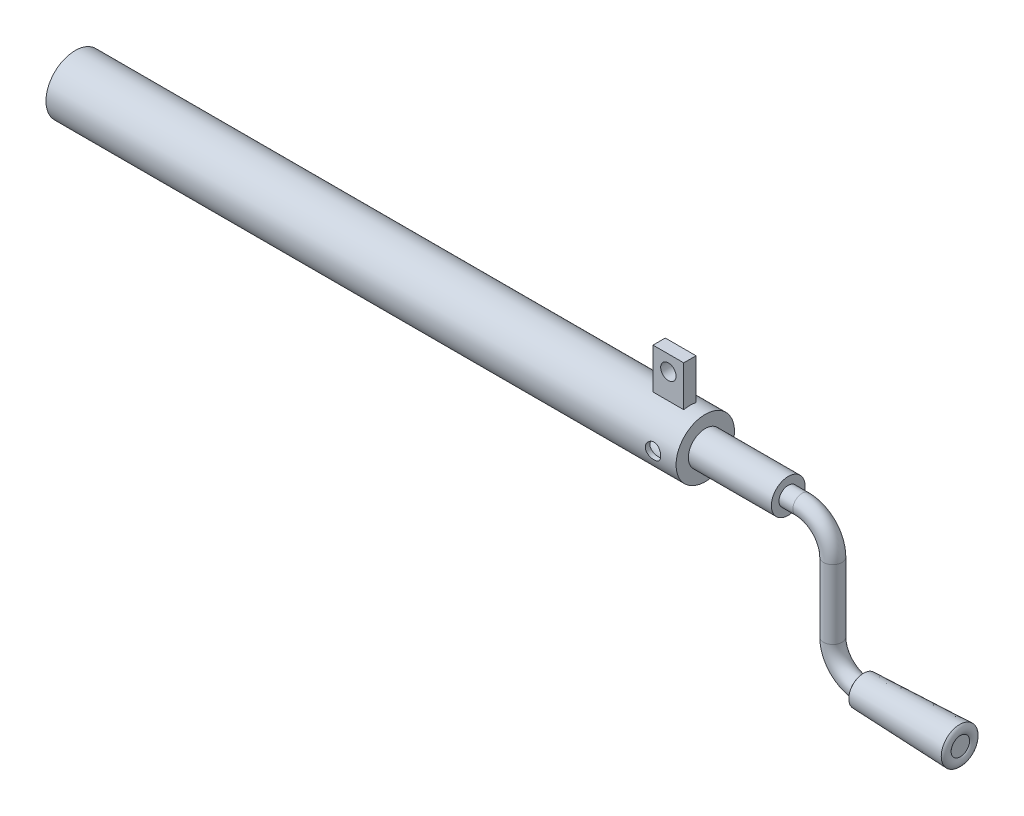
ISO-10303-21;
HEADER;
FILE_DESCRIPTION(('STEP AP214'),'2;1');
FILE_NAME('part.step','',(''),(''),'','','');
FILE_SCHEMA(('AUTOMOTIVE_DESIGN { 1 0 10303 214 1 1 1 1 }'));
ENDSEC;
DATA;
#1=APPLICATION_CONTEXT('core data for automotive mechanical design processes');
#2=APPLICATION_PROTOCOL_DEFINITION('international standard','automotive_design',2000,#1);
#3=PRODUCT_CONTEXT('',#1,'mechanical');
#4=PRODUCT('Part','Part','',(#3));
#5=PRODUCT_RELATED_PRODUCT_CATEGORY('part','',(#4));
#6=PRODUCT_DEFINITION_FORMATION('','',#4);
#7=PRODUCT_DEFINITION_CONTEXT('part definition',#1,'design');
#8=PRODUCT_DEFINITION('design','',#6,#7);
#9=PRODUCT_DEFINITION_SHAPE('','',#8);
#10=(LENGTH_UNIT() NAMED_UNIT(*) SI_UNIT(.MILLI.,.METRE.));
#11=(NAMED_UNIT(*) PLANE_ANGLE_UNIT() SI_UNIT($,.RADIAN.));
#12=(NAMED_UNIT(*) SI_UNIT($,.STERADIAN.) SOLID_ANGLE_UNIT());
#13=UNCERTAINTY_MEASURE_WITH_UNIT(LENGTH_MEASURE(1.E-05),#10,'distance_accuracy_value','');
#14=(GEOMETRIC_REPRESENTATION_CONTEXT(3) GLOBAL_UNCERTAINTY_ASSIGNED_CONTEXT((#13)) GLOBAL_UNIT_ASSIGNED_CONTEXT((#10,
#11,#12)) REPRESENTATION_CONTEXT('',''));
#15=CARTESIAN_POINT('',(0.,0.,0.));
#16=DIRECTION('',(0.,0.,1.));
#17=DIRECTION('',(1.,0.,0.));
#18=AXIS2_PLACEMENT_3D('',#15,#16,#17);
#19=CARTESIAN_POINT('',(464.,0.,0.));
#20=DIRECTION('',(1.,0.,0.));
#21=DIRECTION('',(0.,0.,-1.));
#22=AXIS2_PLACEMENT_3D('',#19,#20,#21);
#23=PLANE('',#22);
#24=CARTESIAN_POINT('',(464.,0.,0.));
#25=DIRECTION('',(1.,0.,0.));
#26=DIRECTION('',(0.,0.,-1.));
#27=AXIS2_PLACEMENT_3D('',#24,#25,#26);
#28=CIRCLE('',#27,11.);
#29=CARTESIAN_POINT('',(464.,0.,-11.));
#30=VERTEX_POINT('',#29);
#31=EDGE_CURVE('E12',#30,#30,#28,.T.);
#32=ORIENTED_EDGE('',*,*,#31,.T.);
#33=EDGE_LOOP('',(#32));
#34=FACE_BOUND('',#33,.T.);
#35=CARTESIAN_POINT('',(464.,0.,0.));
#36=DIRECTION('',(1.,0.,0.));
#37=DIRECTION('',(0.,0.,-1.));
#38=AXIS2_PLACEMENT_3D('',#35,#36,#37);
#39=CIRCLE('',#38,6.);
#40=CARTESIAN_POINT('',(464.,0.,-6.));
#41=VERTEX_POINT('',#40);
#42=EDGE_CURVE('E78',#41,#41,#39,.T.);
#43=ORIENTED_EDGE('',*,*,#42,.F.);
#44=EDGE_LOOP('',(#43));
#45=FACE_BOUND('',#44,.T.);
#46=ADVANCED_FACE('F67',(#34,#45),#23,.T.);
#47=CARTESIAN_POINT('',(410.,0.,0.));
#48=DIRECTION('',(1.,0.,0.));
#49=DIRECTION('',(0.,0.,-1.));
#50=AXIS2_PLACEMENT_3D('',#47,#48,#49);
#51=PLANE('',#50);
#52=CARTESIAN_POINT('',(410.,0.,0.));
#53=DIRECTION('',(1.,0.,0.));
#54=DIRECTION('',(0.,0.,-1.));
#55=AXIS2_PLACEMENT_3D('',#52,#53,#54);
#56=CIRCLE('',#55,11.);
#57=CARTESIAN_POINT('',(410.,0.,-11.));
#58=VERTEX_POINT('',#57);
#59=EDGE_CURVE('E71',#58,#58,#56,.T.);
#60=ORIENTED_EDGE('',*,*,#59,.F.);
#61=EDGE_LOOP('',(#60));
#62=FACE_BOUND('',#61,.T.);
#63=CARTESIAN_POINT('',(410.,0.,0.));
#64=DIRECTION('',(1.,0.,0.));
#65=DIRECTION('',(0.,0.,-1.));
#66=AXIS2_PLACEMENT_3D('',#63,#64,#65);
#67=CIRCLE('',#66,6.);
#68=CARTESIAN_POINT('',(410.,0.,-6.));
#69=VERTEX_POINT('',#68);
#70=EDGE_CURVE('E80',#69,#69,#67,.T.);
#71=ORIENTED_EDGE('',*,*,#70,.T.);
#72=EDGE_LOOP('',(#71));
#73=FACE_BOUND('',#72,.T.);
#74=ADVANCED_FACE('F90',(#62,#73),#51,.F.);
#75=CARTESIAN_POINT('',(464.,0.,0.));
#76=DIRECTION('',(-1.,0.,0.));
#77=DIRECTION('',(0.,0.,1.));
#78=AXIS2_PLACEMENT_3D('',#75,#76,#77);
#79=CYLINDRICAL_SURFACE('',#78,11.);
#80=ORIENTED_EDGE('',*,*,#31,.F.);
#81=EDGE_LOOP('',(#80));
#82=FACE_BOUND('',#81,.T.);
#83=ORIENTED_EDGE('',*,*,#59,.T.);
#84=EDGE_LOOP('',(#83));
#85=FACE_BOUND('',#84,.T.);
#86=ADVANCED_FACE('F69',(#82,#85),#79,.T.);
#87=CARTESIAN_POINT('',(464.,0.,0.));
#88=DIRECTION('',(-1.,0.,0.));
#89=DIRECTION('',(0.,0.,1.));
#90=AXIS2_PLACEMENT_3D('',#87,#88,#89);
#91=CYLINDRICAL_SURFACE('',#90,6.);
#92=ORIENTED_EDGE('',*,*,#42,.T.);
#93=EDGE_LOOP('',(#92));
#94=FACE_BOUND('',#93,.T.);
#95=ORIENTED_EDGE('',*,*,#70,.F.);
#96=EDGE_LOOP('',(#95));
#97=FACE_BOUND('',#96,.T.);
#98=ADVANCED_FACE('F86',(#94,#97),#91,.F.);
#99=CLOSED_SHELL('',(#46,#74,#86,#98));
#100=MANIFOLD_SOLID_BREP('B2',#99);
#101=CARTESIAN_POINT('',(410.,0.,0.));
#102=DIRECTION('',(-1.,0.,0.));
#103=DIRECTION('',(0.,0.,1.));
#104=AXIS2_PLACEMENT_3D('',#101,#102,#103);
#105=CYLINDRICAL_SURFACE('',#104,16.);
#106=CARTESIAN_POINT('',(0.,0.,0.));
#107=DIRECTION('',(1.,0.,0.));
#108=DIRECTION('',(0.,0.,-1.));
#109=AXIS2_PLACEMENT_3D('',#106,#107,#108);
#110=CIRCLE('',#109,16.);
#111=CARTESIAN_POINT('',(0.,0.,-16.));
#112=VERTEX_POINT('',#111);
#113=EDGE_CURVE('E233',#112,#112,#110,.T.);
#114=ORIENTED_EDGE('',*,*,#113,.F.);
#115=EDGE_LOOP('',(#114));
#116=FACE_BOUND('',#115,.T.);
#117=CARTESIAN_POINT('',(400.,0.,-16.));
#118=CARTESIAN_POINT('',(399.99999821365,0.273756740698176,-15.9999986351195));
#119=CARTESIAN_POINT('',(399.977443092222,0.547532210011403,-15.9929077993933));
#120=CARTESIAN_POINT('',(399.888055033843,1.08707683835381,-15.9653157635526));
#121=CARTESIAN_POINT('',(399.821212074542,1.35284417090373,-15.9448115279957));
#122=CARTESIAN_POINT('',(399.645722515217,1.86851417460313,-15.892632627915));
#123=CARTESIAN_POINT('',(399.537140621389,2.11844070794285,-15.860975259956));
#124=CARTESIAN_POINT('',(399.281530729286,2.59653920938622,-15.7897587664487));
#125=CARTESIAN_POINT('',(399.134496672876,2.82470774178094,-15.7501983960149));
#126=CARTESIAN_POINT('',(398.801376031933,3.2598613398077,-15.6660085495921));
#127=CARTESIAN_POINT('',(398.614316459763,3.46608011262122,-15.621268637007));
#128=CARTESIAN_POINT('',(398.208526430338,3.84478952815345,-15.5324018550409));
#129=CARTESIAN_POINT('',(397.989790089993,4.01727389161515,-15.4882751012093));
#130=CARTESIAN_POINT('',(397.520221744793,4.32777345930636,-15.4044457876485));
#131=CARTESIAN_POINT('',(397.268730089992,4.4648313659311,-15.3648795310221));
#132=CARTESIAN_POINT('',(396.744830740177,4.69438964299239,-15.2963120709366));
#133=CARTESIAN_POINT('',(396.472428576856,4.78690175085854,-15.2673080849026));
#134=CARTESIAN_POINT('',(395.923087690166,4.92193839721856,-15.224304279618));
#135=CARTESIAN_POINT('',(395.646532625432,4.96588440031618,-15.2098789171452));
#136=CARTESIAN_POINT('',(395.089627524365,5.00698220147792,-15.1964022056731));
#137=CARTESIAN_POINT('',(394.809278516739,5.00414643984172,-15.1973467694717));
#138=CARTESIAN_POINT('',(394.264502158889,4.95287298929816,-15.2141275626545));
#139=CARTESIAN_POINT('',(393.999883496448,4.90624231472932,-15.229373668447));
#140=CARTESIAN_POINT('',(393.482431373751,4.77163253417958,-15.272081024701));
#141=CARTESIAN_POINT('',(393.229599169142,4.68364903377185,-15.2995435733467));
#142=CARTESIAN_POINT('',(392.738592222302,4.46755498726519,-15.3640417609541));
#143=CARTESIAN_POINT('',(392.500685557241,4.33887702648703,-15.4012113865356));
#144=CARTESIAN_POINT('',(392.049248928475,4.0454408295101,-15.4808742631002));
#145=CARTESIAN_POINT('',(391.835725318983,3.88067322086203,-15.523368895754));
#146=CARTESIAN_POINT('',(391.428900226334,3.51086781672957,-15.6112611120491));
#147=CARTESIAN_POINT('',(391.236961768882,3.30433828237154,-15.6567027842357));
#148=CARTESIAN_POINT('',(390.890112425681,2.86145763238182,-15.7436628303753));
#149=CARTESIAN_POINT('',(390.735204283123,2.625104309396,-15.7851809135328));
#150=CARTESIAN_POINT('',(390.465889245595,2.1266584418619,-15.8600517956098));
#151=CARTESIAN_POINT('',(390.351807458144,1.86437962767713,-15.8933384259289));
#152=CARTESIAN_POINT('',(390.169787996594,1.32307191113054,-15.9475182331416));
#153=CARTESIAN_POINT('',(390.101836311046,1.04404812289841,-15.9684151730059));
#154=CARTESIAN_POINT('',(390.016327829684,0.488740629161367,-15.9948555758007));
#155=CARTESIAN_POINT('',(389.996925825626,0.212767395155359,-16.0009609158175));
#156=CARTESIAN_POINT('',(390.003864906549,-0.338521222930353,-15.9987919892393));
#157=CARTESIAN_POINT('',(390.03019930929,-0.613836697226041,-15.9905198232454));
#158=CARTESIAN_POINT('',(390.126382370426,-1.1488773319034,-15.9608945507905));
#159=CARTESIAN_POINT('',(390.19513307045,-1.40881991368376,-15.9398717244275));
#160=CARTESIAN_POINT('',(390.372857409467,-1.91340771544551,-15.8872048551716));
#161=CARTESIAN_POINT('',(390.4818360161,-2.15805104179623,-15.8555595005737));
#162=CARTESIAN_POINT('',(390.739892866195,-2.63172962668875,-15.783941710377));
#163=CARTESIAN_POINT('',(390.889883949987,-2.86023895915117,-15.7437850727067));
#164=CARTESIAN_POINT('',(391.22461284047,-3.28946340384104,-15.6597364001372));
#165=CARTESIAN_POINT('',(391.409360070979,-3.49017095217579,-15.6158433539155));
#166=CARTESIAN_POINT('',(391.817035560208,-3.86634985167606,-15.5270797953257));
#167=CARTESIAN_POINT('',(392.041186654957,-4.04050609358124,-15.4822394682577));
#168=CARTESIAN_POINT('',(392.516506465507,-4.34885000980605,-15.3984778838242));
#169=CARTESIAN_POINT('',(392.767674752108,-4.48303831893718,-15.3595565324524));
#170=CARTESIAN_POINT('',(393.289380691482,-4.70680333922168,-15.2924712932348));
#171=CARTESIAN_POINT('',(393.559838597743,-4.79655278224049,-15.264265854275));
#172=CARTESIAN_POINT('',(394.113089972994,-4.9289157727236,-15.2220468337724));
#173=CARTESIAN_POINT('',(394.395878705374,-4.97154725655978,-15.2080278520491));
#174=CARTESIAN_POINT('',(394.952016350322,-5.00717624632502,-15.1963317085551));
#175=CARTESIAN_POINT('',(395.22521381539,-5.00233118486541,-15.1979441840057));
#176=CARTESIAN_POINT('',(395.766698339768,-4.94835272515332,-15.2156036150361));
#177=CARTESIAN_POINT('',(396.034985627547,-4.89922139290047,-15.2316498972642));
#178=CARTESIAN_POINT('',(396.555176158367,-4.7595091965447,-15.2758725673356));
#179=CARTESIAN_POINT('',(396.807261764373,-4.66954569624033,-15.3038679276103));
#180=CARTESIAN_POINT('',(397.292961654136,-4.45120909339998,-15.3687881701826));
#181=CARTESIAN_POINT('',(397.526572168314,-4.32282817776947,-15.4057148685869));
#182=CARTESIAN_POINT('',(397.978583881759,-4.02542700053973,-15.4861394813401));
#183=CARTESIAN_POINT('',(398.196032518001,-3.85501334096528,-15.5298379569183));
#184=CARTESIAN_POINT('',(398.599945312448,-3.48083598561918,-15.6179599528484));
#185=CARTESIAN_POINT('',(398.786401155964,-3.27706336937753,-15.6623836642662));
#186=CARTESIAN_POINT('',(399.129130153452,-2.83394665129336,-15.7486908780989));
#187=CARTESIAN_POINT('',(399.2842189458,-2.59365829794952,-15.7904440692269));
#188=CARTESIAN_POINT('',(399.551595660558,-2.08911655205459,-15.8650707718751));
#189=CARTESIAN_POINT('',(399.663900408567,-1.82487263118178,-15.8979477726329));
#190=CARTESIAN_POINT('',(399.834365470434,-1.3029905414959,-15.9488260293388));
#191=CARTESIAN_POINT('',(399.896299469221,-1.04668134845018,-15.9678496322456));
#192=CARTESIAN_POINT('',(399.979113439871,-0.526919581760985,-15.9934360136194));
#193=CARTESIAN_POINT('',(400.000001719216,-0.26346846455869,-16.0000013135858));
#194=CARTESIAN_POINT('',(400.,0.,-16.));
#195=B_SPLINE_CURVE_WITH_KNOTS('',3,(#117,#118,#119,#120,#121,#122,#123,#124,#125,#126,#127,
#128,#129,#130,#131,#132,#133,#134,#135,#136,#137,#138,#139,#140,#141,#142,#143,#144,#145,#146,
#147,#148,#149,#150,#151,#152,#153,#154,#155,#156,#157,#158,#159,#160,#161,#162,#163,#164,#165,
#166,#167,#168,#169,#170,#171,#172,#173,#174,#175,#176,#177,#178,#179,#180,#181,#182,#183,#184,
#185,#186,#187,#188,#189,#190,#191,#192,#193,#194),.UNSPECIFIED.,.T.,.F.,(4,2,2,2,2,2,2,2,2,2,2,
2,2,2,2,2,2,2,2,2,2,2,2,2,2,2,2,2,2,2,2,2,2,2,2,2,2,2,4),(0.,0.820301797730033,1.64078929339626,
2.46000991680977,3.27935968623355,4.12151288780638,4.96382269725106,5.82695084991454,
6.68985145121467,7.52676600672195,8.36345801183908,9.167076696952,9.97078079925605,
10.7862257089153,11.6018826405078,12.4546698912775,13.3075202966256,14.1670184276843,
15.0262553798757,15.852302742023,16.678229426068,17.4836250690084,18.2891202014735,
19.1142529896272,19.9396098284638,20.797671148619,21.6557188394419,22.5104046302277,
23.3647649559871,24.1804881394268,24.9961732705187,25.7999165363422,26.6038233736823,
27.4391805607299,28.274761495409,29.1376267255319,30.0001522671288,30.789785466537,
31.5792588309973),.UNSPECIFIED.);
#196=CARTESIAN_POINT('',(400.,0.,-16.));
#197=VERTEX_POINT('',#196);
#198=EDGE_CURVE('E193',#197,#197,#195,.T.);
#199=ORIENTED_EDGE('',*,*,#198,.F.);
#200=CARTESIAN_POINT('',(400.,-1.2490009027033E-13,0.));
#201=DIRECTION('',(1.,0.,0.));
#202=DIRECTION('',(0.,0.,-1.));
#203=AXIS2_PLACEMENT_3D('',#200,#201,#202);
#204=CIRCLE('',#203,16.0000000000001);
#205=CARTESIAN_POINT('',(400.,0.,16.0000000000001));
#206=VERTEX_POINT('',#205);
#207=EDGE_CURVE('E154',#197,#206,#204,.T.);
#208=ORIENTED_EDGE('',*,*,#207,.T.);
#209=CARTESIAN_POINT('',(400.,0.,16.));
#210=CARTESIAN_POINT('',(399.99999821365,-0.273756740698179,15.9999986351195));
#211=CARTESIAN_POINT('',(399.977443092222,-0.547532210011409,15.9929077993933));
#212=CARTESIAN_POINT('',(399.888055033843,-1.08707683835382,15.9653157635526));
#213=CARTESIAN_POINT('',(399.821212074542,-1.35284417090373,15.9448115279957));
#214=CARTESIAN_POINT('',(399.645722515217,-1.86851417460312,15.892632627915));
#215=CARTESIAN_POINT('',(399.537140621389,-2.11844070794283,15.860975259956));
#216=CARTESIAN_POINT('',(399.281530729286,-2.5965392093862,15.7897587664487));
#217=CARTESIAN_POINT('',(399.134496672876,-2.82470774178093,15.7501983960149));
#218=CARTESIAN_POINT('',(398.801376031933,-3.2598613398077,15.6660085495921));
#219=CARTESIAN_POINT('',(398.614316459763,-3.46608011262122,15.621268637007));
#220=CARTESIAN_POINT('',(398.208526430338,-3.84478952815345,15.5324018550409));
#221=CARTESIAN_POINT('',(397.989790089993,-4.01727389161515,15.4882751012093));
#222=CARTESIAN_POINT('',(397.520221744793,-4.32777345930636,15.4044457876485));
#223=CARTESIAN_POINT('',(397.268730089992,-4.4648313659311,15.3648795310221));
#224=CARTESIAN_POINT('',(396.744830740177,-4.69438964299239,15.2963120709366));
#225=CARTESIAN_POINT('',(396.472428576856,-4.78690175085854,15.2673080849026));
#226=CARTESIAN_POINT('',(395.923087690166,-4.92193839721856,15.224304279618));
#227=CARTESIAN_POINT('',(395.646532625432,-4.96588440031618,15.2098789171452));
#228=CARTESIAN_POINT('',(395.089627524365,-5.00698220147792,15.1964022056731));
#229=CARTESIAN_POINT('',(394.809278516739,-5.00414643984172,15.1973467694717));
#230=CARTESIAN_POINT('',(394.264502158889,-4.95287298929816,15.2141275626545));
#231=CARTESIAN_POINT('',(393.999883496448,-4.90624231472932,15.229373668447));
#232=CARTESIAN_POINT('',(393.482431373751,-4.77163253417958,15.272081024701));
#233=CARTESIAN_POINT('',(393.229599169142,-4.68364903377185,15.2995435733467));
#234=CARTESIAN_POINT('',(392.738592222302,-4.46755498726519,15.3640417609541));
#235=CARTESIAN_POINT('',(392.500685557241,-4.33887702648703,15.4012113865356));
#236=CARTESIAN_POINT('',(392.049248928475,-4.0454408295101,15.4808742631002));
#237=CARTESIAN_POINT('',(391.835725318983,-3.88067322086203,15.523368895754));
#238=CARTESIAN_POINT('',(391.428900226334,-3.51086781672957,15.6112611120491));
#239=CARTESIAN_POINT('',(391.236961768882,-3.30433828237154,15.6567027842357));
#240=CARTESIAN_POINT('',(390.890112425681,-2.86145763238182,15.7436628303753));
#241=CARTESIAN_POINT('',(390.735204283123,-2.625104309396,15.7851809135328));
#242=CARTESIAN_POINT('',(390.465889245595,-2.1266584418619,15.8600517956098));
#243=CARTESIAN_POINT('',(390.351807458144,-1.86437962767713,15.8933384259289));
#244=CARTESIAN_POINT('',(390.169787996594,-1.32307191113054,15.9475182331416));
#245=CARTESIAN_POINT('',(390.101836311046,-1.04404812289841,15.9684151730059));
#246=CARTESIAN_POINT('',(390.016327829684,-0.488740629161367,15.9948555758007));
#247=CARTESIAN_POINT('',(389.996925825626,-0.212767395155359,16.0009609158175));
#248=CARTESIAN_POINT('',(390.003864906549,0.338521222930353,15.9987919892393));
#249=CARTESIAN_POINT('',(390.03019930929,0.613836697226042,15.9905198232454));
#250=CARTESIAN_POINT('',(390.126382370426,1.1488773319034,15.9608945507905));
#251=CARTESIAN_POINT('',(390.19513307045,1.40881991368376,15.9398717244275));
#252=CARTESIAN_POINT('',(390.372857409467,1.91340771544551,15.8872048551716));
#253=CARTESIAN_POINT('',(390.4818360161,2.15805104179623,15.8555595005737));
#254=CARTESIAN_POINT('',(390.739892866195,2.63172962668875,15.783941710377));
#255=CARTESIAN_POINT('',(390.889883949987,2.86023895915117,15.7437850727067));
#256=CARTESIAN_POINT('',(391.22461284047,3.28946340384104,15.6597364001372));
#257=CARTESIAN_POINT('',(391.409360070979,3.49017095217579,15.6158433539155));
#258=CARTESIAN_POINT('',(391.817035560208,3.86634985167606,15.5270797953257));
#259=CARTESIAN_POINT('',(392.041186654957,4.04050609358124,15.4822394682577));
#260=CARTESIAN_POINT('',(392.516506465507,4.34885000980605,15.3984778838242));
#261=CARTESIAN_POINT('',(392.767674752108,4.48303831893718,15.3595565324524));
#262=CARTESIAN_POINT('',(393.289380691482,4.70680333922168,15.2924712932348));
#263=CARTESIAN_POINT('',(393.559838597743,4.79655278224049,15.264265854275));
#264=CARTESIAN_POINT('',(394.113089972994,4.9289157727236,15.2220468337724));
#265=CARTESIAN_POINT('',(394.395878705374,4.97154725655978,15.2080278520491));
#266=CARTESIAN_POINT('',(394.952016350322,5.00717624632502,15.1963317085551));
#267=CARTESIAN_POINT('',(395.22521381539,5.00233118486541,15.1979441840057));
#268=CARTESIAN_POINT('',(395.766698339768,4.94835272515332,15.2156036150361));
#269=CARTESIAN_POINT('',(396.034985627547,4.89922139290047,15.2316498972642));
#270=CARTESIAN_POINT('',(396.555176158367,4.7595091965447,15.2758725673356));
#271=CARTESIAN_POINT('',(396.807261764373,4.66954569624033,15.3038679276103));
#272=CARTESIAN_POINT('',(397.292961654136,4.45120909339998,15.3687881701826));
#273=CARTESIAN_POINT('',(397.526572168314,4.32282817776947,15.4057148685869));
#274=CARTESIAN_POINT('',(397.978583881759,4.02542700053973,15.4861394813401));
#275=CARTESIAN_POINT('',(398.196032518001,3.85501334096528,15.5298379569183));
#276=CARTESIAN_POINT('',(398.599945312448,3.48083598561918,15.6179599528484));
#277=CARTESIAN_POINT('',(398.786401155964,3.27706336937753,15.6623836642662));
#278=CARTESIAN_POINT('',(399.129130153452,2.83394665129336,15.7486908780989));
#279=CARTESIAN_POINT('',(399.2842189458,2.59365829794952,15.7904440692269));
#280=CARTESIAN_POINT('',(399.551595660558,2.08911655205459,15.8650707718751));
#281=CARTESIAN_POINT('',(399.663900408567,1.82487263118178,15.8979477726329));
#282=CARTESIAN_POINT('',(399.834365470434,1.3029905414959,15.9488260293388));
#283=CARTESIAN_POINT('',(399.896299469221,1.04668134845018,15.9678496322456));
#284=CARTESIAN_POINT('',(399.979113439871,0.526919581760985,15.9934360136194));
#285=CARTESIAN_POINT('',(400.000001719216,0.26346846455869,16.0000013135858));
#286=CARTESIAN_POINT('',(400.,0.,16.));
#287=B_SPLINE_CURVE_WITH_KNOTS('',3,(#209,#210,#211,#212,#213,#214,#215,#216,#217,#218,#219,
#220,#221,#222,#223,#224,#225,#226,#227,#228,#229,#230,#231,#232,#233,#234,#235,#236,#237,#238,
#239,#240,#241,#242,#243,#244,#245,#246,#247,#248,#249,#250,#251,#252,#253,#254,#255,#256,#257,
#258,#259,#260,#261,#262,#263,#264,#265,#266,#267,#268,#269,#270,#271,#272,#273,#274,#275,#276,
#277,#278,#279,#280,#281,#282,#283,#284,#285,#286),.UNSPECIFIED.,.T.,.F.,(4,2,2,2,2,2,2,2,2,2,2,
2,2,2,2,2,2,2,2,2,2,2,2,2,2,2,2,2,2,2,2,2,2,2,2,2,2,2,4),(0.,0.820301797730043,1.64078929339626,
2.46000991680975,3.27935968623355,4.12151288780638,4.96382269725106,5.82695084991454,
6.68985145121467,7.52676600672195,8.36345801183908,9.16707669695199,9.97078079925604,
10.7862257089153,11.6018826405078,12.4546698912775,13.3075202966256,14.1670184276843,
15.0262553798757,15.852302742023,16.678229426068,17.4836250690084,18.2891202014735,
19.1142529896272,19.9396098284638,20.797671148619,21.6557188394419,22.5104046302277,
23.3647649559871,24.1804881394268,24.9961732705187,25.7999165363422,26.6038233736823,
27.4391805607298,28.274761495409,29.1376267255318,30.0001522671288,30.789785466537,
31.5792588309973),.UNSPECIFIED.);
#288=EDGE_CURVE('E138',#206,#206,#287,.T.);
#289=ORIENTED_EDGE('',*,*,#288,.F.);
#290=EDGE_CURVE('E184',#206,#197,#204,.T.);
#291=ORIENTED_EDGE('',*,*,#290,.T.);
#292=EDGE_LOOP('',(#199,#208,#289,#291));
#293=FACE_BOUND('',#292,.T.);
#294=ADVANCED_FACE('F133',(#116,#293),#105,.F.);
#295=CARTESIAN_POINT('',(410.,0.,0.));
#296=DIRECTION('',(1.,0.,0.));
#297=DIRECTION('',(0.,0.,-1.));
#298=AXIS2_PLACEMENT_3D('',#295,#296,#297);
#299=PLANE('',#298);
#300=CARTESIAN_POINT('',(410.,-1.2490009027033E-13,0.));
#301=DIRECTION('',(-1.,0.,0.));
#302=DIRECTION('',(0.,0.,1.));
#303=AXIS2_PLACEMENT_3D('',#300,#301,#302);
#304=CIRCLE('',#303,6.);
#305=CARTESIAN_POINT('',(410.,-1.2490009027033E-13,6.));
#306=VERTEX_POINT('',#305);
#307=EDGE_CURVE('E518',#306,#306,#304,.T.);
#308=ORIENTED_EDGE('',*,*,#307,.T.);
#309=EDGE_LOOP('',(#308));
#310=FACE_BOUND('',#309,.T.);
#311=CARTESIAN_POINT('',(410.,0.,0.));
#312=DIRECTION('',(1.,0.,0.));
#313=DIRECTION('',(0.,0.,-1.));
#314=AXIS2_PLACEMENT_3D('',#311,#312,#313);
#315=CIRCLE('',#314,19.);
#316=CARTESIAN_POINT('',(410.,0.,-19.));
#317=VERTEX_POINT('',#316);
#318=EDGE_CURVE('E65',#317,#317,#315,.T.);
#319=ORIENTED_EDGE('',*,*,#318,.T.);
#320=EDGE_LOOP('',(#319));
#321=FACE_BOUND('',#320,.T.);
#322=ADVANCED_FACE('F243',(#310,#321),#299,.T.);
#323=CARTESIAN_POINT('',(0.,0.,0.));
#324=DIRECTION('',(1.,0.,0.));
#325=DIRECTION('',(0.,0.,-1.));
#326=AXIS2_PLACEMENT_3D('',#323,#324,#325);
#327=PLANE('',#326);
#328=CARTESIAN_POINT('',(0.,0.,0.));
#329=DIRECTION('',(1.,0.,0.));
#330=DIRECTION('',(0.,0.,-1.));
#331=AXIS2_PLACEMENT_3D('',#328,#329,#330);
#332=CIRCLE('',#331,19.);
#333=CARTESIAN_POINT('',(0.,0.,-19.));
#334=VERTEX_POINT('',#333);
#335=EDGE_CURVE('E147',#334,#334,#332,.T.);
#336=ORIENTED_EDGE('',*,*,#335,.F.);
#337=EDGE_LOOP('',(#336));
#338=FACE_BOUND('',#337,.T.);
#339=ORIENTED_EDGE('',*,*,#113,.T.);
#340=EDGE_LOOP('',(#339));
#341=FACE_BOUND('',#340,.T.);
#342=ADVANCED_FACE('F241',(#338,#341),#327,.F.);
#343=CARTESIAN_POINT('',(410.,0.,0.));
#344=DIRECTION('',(-1.,0.,0.));
#345=DIRECTION('',(0.,0.,1.));
#346=AXIS2_PLACEMENT_3D('',#343,#344,#345);
#347=CYLINDRICAL_SURFACE('',#346,19.);
#348=DIRECTION('',(-1.,0.,0.));
#349=VECTOR('',#348,1.);
#350=CARTESIAN_POINT('',(410.,18.5741756210067,-4.00000000000001));
#351=LINE('',#350,#349);
#352=CARTESIAN_POINT('',(400.,18.5741756209836,-4.));
#353=VERTEX_POINT('',#352);
#354=CARTESIAN_POINT('',(380.,18.5741756210067,-3.99999999999999));
#355=VERTEX_POINT('',#354);
#356=EDGE_CURVE('E474',#353,#355,#351,.T.);
#357=ORIENTED_EDGE('',*,*,#356,.F.);
#358=CARTESIAN_POINT('',(400.,0.,0.));
#359=DIRECTION('',(1.,0.,0.));
#360=DIRECTION('',(0.,0.,-1.));
#361=AXIS2_PLACEMENT_3D('',#358,#359,#360);
#362=CIRCLE('',#361,19.);
#363=CARTESIAN_POINT('',(400.,18.5741756209836,4.));
#364=VERTEX_POINT('',#363);
#365=EDGE_CURVE('E227',#364,#353,#362,.F.);
#366=ORIENTED_EDGE('',*,*,#365,.F.);
#367=DIRECTION('',(-1.,0.,0.));
#368=VECTOR('',#367,1.);
#369=CARTESIAN_POINT('',(410.,18.5741756210067,4.));
#370=LINE('',#369,#368);
#371=CARTESIAN_POINT('',(380.,18.5741756209836,4.));
#372=VERTEX_POINT('',#371);
#373=EDGE_CURVE('E477',#372,#364,#370,.F.);
#374=ORIENTED_EDGE('',*,*,#373,.F.);
#375=CARTESIAN_POINT('',(380.,0.,0.));
#376=DIRECTION('',(-1.,0.,0.));
#377=DIRECTION('',(0.,0.,1.));
#378=AXIS2_PLACEMENT_3D('',#375,#376,#377);
#379=CIRCLE('',#378,19.);
#380=EDGE_CURVE('E476',#355,#372,#379,.F.);
#381=ORIENTED_EDGE('',*,*,#380,.F.);
#382=EDGE_LOOP('',(#357,#366,#374,#381));
#383=FACE_BOUND('',#382,.T.);
#384=CARTESIAN_POINT('',(400.,0.,19.));
#385=CARTESIAN_POINT('',(399.999993183317,-0.27576932640033,18.9999957178638));
#386=CARTESIAN_POINT('',(399.977108837027,-0.551612339964101,18.9939369110743));
#387=CARTESIAN_POINT('',(399.886332722549,-1.09536084420814,18.9703552522905));
#388=CARTESIAN_POINT('',(399.81841846832,-1.36326229934773,18.9528266728315));
#389=CARTESIAN_POINT('',(399.639936849204,-1.88319959043664,18.9082415265209));
#390=CARTESIAN_POINT('',(399.529423671219,-2.13525511097028,18.8811970679014));
#391=CARTESIAN_POINT('',(399.269079957872,-2.61725305763117,18.8204430306565));
#392=CARTESIAN_POINT('',(399.119247076392,-2.84719416312158,18.7867330543442));
#393=CARTESIAN_POINT('',(398.780936768605,-3.28363987258851,18.7154388327318));
#394=CARTESIAN_POINT('',(398.591735344869,-3.48957269264307,18.6777897345587));
#395=CARTESIAN_POINT('',(398.181606882668,-3.86718169173116,18.6032800591516));
#396=CARTESIAN_POINT('',(397.960675877972,-4.03885358169211,18.5664195811586));
#397=CARTESIAN_POINT('',(397.488822463247,-4.34583417024356,18.4969993222001));
#398=CARTESIAN_POINT('',(397.237461495412,-4.4804889973633,18.4645214758363));
#399=CARTESIAN_POINT('',(396.714675791554,-4.70540295052889,18.4084956128093));
#400=CARTESIAN_POINT('',(396.443254657921,-4.79567002552071,18.3849459974541));
#401=CARTESIAN_POINT('',(395.894376143786,-4.9272679026951,18.3501118941767));
#402=CARTESIAN_POINT('',(395.617183704304,-4.96963355234476,18.3385684873096));
#403=CARTESIAN_POINT('',(395.059403988658,-5.00745164847047,18.328279903082));
#404=CARTESIAN_POINT('',(394.778817338173,-5.00291261345675,18.3295324018157));
#405=CARTESIAN_POINT('',(394.230259541084,-4.9478726318895,18.3444621543897));
#406=CARTESIAN_POINT('',(393.962152532456,-4.89861973809087,18.3578020069334));
#407=CARTESIAN_POINT('',(393.438147992583,-4.75754734011485,18.3948637106681));
#408=CARTESIAN_POINT('',(393.182251416105,-4.6657245132653,18.4185863722508));
#409=CARTESIAN_POINT('',(392.68665842585,-4.4410917967273,18.4740402179201));
#410=CARTESIAN_POINT('',(392.447171791874,-4.307841063398,18.5058568359772));
#411=CARTESIAN_POINT('',(391.993517281704,-4.00444274039804,18.573867245553));
#412=CARTESIAN_POINT('',(391.779354283603,-3.83428805975345,18.6100618777007));
#413=CARTESIAN_POINT('',(391.375291015091,-3.45551254292273,18.6841580271555));
#414=CARTESIAN_POINT('',(391.186376156041,-3.24584253203103,18.7220772644082));
#415=CARTESIAN_POINT('',(390.846190691204,-2.7973361809012,18.794319031737));
#416=CARTESIAN_POINT('',(390.694921493255,-2.55849875038485,18.828641427274));
#417=CARTESIAN_POINT('',(390.433903140077,-2.05693717567474,18.8900243975419));
#418=CARTESIAN_POINT('',(390.324328366327,-1.7941182874357,18.9170543384444));
#419=CARTESIAN_POINT('',(390.151199172408,-1.25291705070341,18.9605851829004));
#420=CARTESIAN_POINT('',(390.087634967372,-0.974538024889804,18.9770883250536));
#421=CARTESIAN_POINT('',(390.009869358731,-0.418531665055095,18.9973691359723));
#422=CARTESIAN_POINT('',(389.994327745994,-0.141104095967862,19.0014922111205));
#423=CARTESIAN_POINT('',(390.009352792251,0.412392174634824,18.9975393920985));
#424=CARTESIAN_POINT('',(390.039914819257,0.6884610098653,18.9894647234237));
#425=CARTESIAN_POINT('',(390.145179091232,1.22664703082867,18.9622464275131));
#426=CARTESIAN_POINT('',(390.21913734007,1.48892004105414,18.9432894848034));
#427=CARTESIAN_POINT('',(390.408233741087,1.99731390900086,18.8964538133382));
#428=CARTESIAN_POINT('',(390.523376294758,2.24343303697949,18.8685741310162));
#429=CARTESIAN_POINT('',(390.794082644266,2.71776721238243,18.8061722513547));
#430=CARTESIAN_POINT('',(390.950380179144,2.94554769813589,18.7715327802268));
#431=CARTESIAN_POINT('',(391.298034060781,3.3721194516033,18.6996172131604));
#432=CARTESIAN_POINT('',(391.489397144565,3.5709051354408,18.6623406114053));
#433=CARTESIAN_POINT('',(391.907998021404,3.93946537763554,18.5880870950829));
#434=CARTESIAN_POINT('',(392.136075326684,4.10829545608394,18.5511463973769));
#435=CARTESIAN_POINT('',(392.618100992258,4.40530154568801,18.4828739909468));
#436=CARTESIAN_POINT('',(392.872048251994,4.53347928531828,18.451542043772));
#437=CARTESIAN_POINT('',(393.39731246913,4.74457728048382,18.3983923637822));
#438=CARTESIAN_POINT('',(393.668517362315,4.82776168851184,18.3765192543106));
#439=CARTESIAN_POINT('',(394.22173645449,4.94715371079316,18.3447420107922));
#440=CARTESIAN_POINT('',(394.50374796097,4.98337294925861,18.3348349151139));
#441=CARTESIAN_POINT('',(395.060918355451,5.00715081173975,18.3283542048942));
#442=CARTESIAN_POINT('',(395.336008690716,4.99622557405376,18.3313651360785));
#443=CARTESIAN_POINT('',(395.880276008434,4.92953140114559,18.3494111434725));
#444=CARTESIAN_POINT('',(396.149453135421,4.87376356323929,18.3644459254538));
#445=CARTESIAN_POINT('',(396.672400902962,4.71983552306686,18.404601627765));
#446=CARTESIAN_POINT('',(396.926269902165,4.6219886449165,18.4296479062774));
#447=CARTESIAN_POINT('',(397.414178327475,4.38692411825136,18.487008102539));
#448=CARTESIAN_POINT('',(397.648214711144,4.24970044321718,18.5193231325886));
#449=CARTESIAN_POINT('',(398.097070825163,3.93514861806086,18.5887388284062));
#450=CARTESIAN_POINT('',(398.311145835146,3.75678207589857,18.6259502628499));
#451=CARTESIAN_POINT('',(398.706818826722,3.36699304774792,18.7003384349729));
#452=CARTESIAN_POINT('',(398.888408943236,3.15556257964811,18.7375151620875));
#453=CARTESIAN_POINT('',(399.217640492711,2.70037417260267,18.8085635163672));
#454=CARTESIAN_POINT('',(399.36450271948,2.45603841361692,18.8423509547618));
#455=CARTESIAN_POINT('',(399.614834901187,1.94526775833221,18.9019003201304));
#456=CARTESIAN_POINT('',(399.718333408212,1.67884754204236,18.9276675250045));
#457=CARTESIAN_POINT('',(399.865096180304,1.1777515930537,18.9648374183622));
#458=CARTESIAN_POINT('',(399.915569401069,0.945286703979938,18.9779285000888));
#459=CARTESIAN_POINT('',(399.983022685552,0.475232463380952,18.9955112347954));
#460=CARTESIAN_POINT('',(400.000005874261,0.237643592071626,19.0000036901212));
#461=CARTESIAN_POINT('',(400.,0.,19.));
#462=B_SPLINE_CURVE_WITH_KNOTS('',3,(#384,#385,#386,#387,#388,#389,#390,#391,#392,#393,#394,
#395,#396,#397,#398,#399,#400,#401,#402,#403,#404,#405,#406,#407,#408,#409,#410,#411,#412,#413,
#414,#415,#416,#417,#418,#419,#420,#421,#422,#423,#424,#425,#426,#427,#428,#429,#430,#431,#432,
#433,#434,#435,#436,#437,#438,#439,#440,#441,#442,#443,#444,#445,#446,#447,#448,#449,#450,#451,
#452,#453,#454,#455,#456,#457,#458,#459,#460,#461),.UNSPECIFIED.,.T.,.F.,(4,2,2,2,2,2,2,2,2,2,2,
2,2,2,2,2,2,2,2,2,2,2,2,2,2,2,2,2,2,2,2,2,2,2,2,2,2,2,4),(0.,0.826436614585049,1.65328622796854,
2.47908752031451,3.30493809758612,4.14758534874999,4.99033802353201,5.84713921235246,
6.70378690953221,7.54155141820611,8.3791637804547,9.19409222959363,10.0090842963107,
10.8330642107705,11.6572025907903,12.5074895148544,13.35780823238,14.2116451980492,
15.0653005285529,15.8949065177972,16.7244291628852,17.5401294360794,18.3559169116766,
19.1873697126649,20.0189824256652,20.873388302508,21.7277578464622,22.5770554513569,
23.4261428089293,24.2481310576986,25.0700991927073,25.8860500675687,26.702125888318,
27.5416338064332,28.3813447077047,29.2384104629446,30.0949110079132,30.8071573512508,
31.5193372309826),.UNSPECIFIED.);
#463=CARTESIAN_POINT('',(400.,0.,19.));
#464=VERTEX_POINT('',#463);
#465=EDGE_CURVE('E200',#464,#464,#462,.T.);
#466=ORIENTED_EDGE('',*,*,#465,.T.);
#467=EDGE_LOOP('',(#466));
#468=FACE_BOUND('',#467,.T.);
#469=CARTESIAN_POINT('',(400.,0.,-19.));
#470=CARTESIAN_POINT('',(399.999993183317,0.27576932640033,-18.9999957178638));
#471=CARTESIAN_POINT('',(399.977108837027,0.551612339964101,-18.9939369110743));
#472=CARTESIAN_POINT('',(399.886332722549,1.09536084420814,-18.9703552522905));
#473=CARTESIAN_POINT('',(399.81841846832,1.36326229934773,-18.9528266728315));
#474=CARTESIAN_POINT('',(399.639936849204,1.88319959043664,-18.9082415265209));
#475=CARTESIAN_POINT('',(399.529423671219,2.13525511097028,-18.8811970679014));
#476=CARTESIAN_POINT('',(399.269079957872,2.61725305763117,-18.8204430306565));
#477=CARTESIAN_POINT('',(399.119247076392,2.84719416312158,-18.7867330543442));
#478=CARTESIAN_POINT('',(398.780936768605,3.28363987258849,-18.7154388327318));
#479=CARTESIAN_POINT('',(398.591735344869,3.48957269264303,-18.6777897345587));
#480=CARTESIAN_POINT('',(398.181606882668,3.86718169173112,-18.6032800591516));
#481=CARTESIAN_POINT('',(397.960675877972,4.03885358169209,-18.5664195811586));
#482=CARTESIAN_POINT('',(397.488822463247,4.34583417024356,-18.4969993222001));
#483=CARTESIAN_POINT('',(397.237461495412,4.4804889973633,-18.4645214758363));
#484=CARTESIAN_POINT('',(396.714675791554,4.70540295052889,-18.4084956128093));
#485=CARTESIAN_POINT('',(396.443254657921,4.79567002552071,-18.3849459974541));
#486=CARTESIAN_POINT('',(395.894376143786,4.9272679026951,-18.3501118941767));
#487=CARTESIAN_POINT('',(395.617183704304,4.96963355234476,-18.3385684873096));
#488=CARTESIAN_POINT('',(395.059403988658,5.00745164847047,-18.328279903082));
#489=CARTESIAN_POINT('',(394.778817338173,5.00291261345675,-18.3295324018157));
#490=CARTESIAN_POINT('',(394.230259541084,4.9478726318895,-18.3444621543897));
#491=CARTESIAN_POINT('',(393.962152532456,4.89861973809087,-18.3578020069334));
#492=CARTESIAN_POINT('',(393.438147992583,4.75754734011485,-18.3948637106681));
#493=CARTESIAN_POINT('',(393.182251416105,4.6657245132653,-18.4185863722508));
#494=CARTESIAN_POINT('',(392.68665842585,4.4410917967273,-18.4740402179201));
#495=CARTESIAN_POINT('',(392.447171791874,4.307841063398,-18.5058568359772));
#496=CARTESIAN_POINT('',(391.993517281704,4.00444274039804,-18.573867245553));
#497=CARTESIAN_POINT('',(391.779354283603,3.83428805975345,-18.6100618777007));
#498=CARTESIAN_POINT('',(391.375291015091,3.45551254292273,-18.6841580271555));
#499=CARTESIAN_POINT('',(391.186376156041,3.24584253203103,-18.7220772644082));
#500=CARTESIAN_POINT('',(390.846190691204,2.7973361809012,-18.794319031737));
#501=CARTESIAN_POINT('',(390.694921493255,2.55849875038485,-18.828641427274));
#502=CARTESIAN_POINT('',(390.433903140077,2.05693717567474,-18.8900243975419));
#503=CARTESIAN_POINT('',(390.324328366327,1.7941182874357,-18.9170543384444));
#504=CARTESIAN_POINT('',(390.151199172408,1.25291705070341,-18.9605851829004));
#505=CARTESIAN_POINT('',(390.087634967372,0.974538024889804,-18.9770883250536));
#506=CARTESIAN_POINT('',(390.009869358731,0.418531665055094,-18.9973691359723));
#507=CARTESIAN_POINT('',(389.994327745994,0.141104095967861,-19.0014922111205));
#508=CARTESIAN_POINT('',(390.009352792251,-0.412392174634825,-18.9975393920985));
#509=CARTESIAN_POINT('',(390.039914819257,-0.688461009865302,-18.9894647234237));
#510=CARTESIAN_POINT('',(390.145179091232,-1.22664703082866,-18.9622464275131));
#511=CARTESIAN_POINT('',(390.21913734007,-1.48892004105413,-18.9432894848034));
#512=CARTESIAN_POINT('',(390.408233741087,-1.99731390900085,-18.8964538133382));
#513=CARTESIAN_POINT('',(390.523376294758,-2.24343303697948,-18.8685741310162));
#514=CARTESIAN_POINT('',(390.794082644266,-2.71776721238243,-18.8061722513547));
#515=CARTESIAN_POINT('',(390.950380179144,-2.94554769813589,-18.7715327802268));
#516=CARTESIAN_POINT('',(391.298034060781,-3.3721194516033,-18.6996172131604));
#517=CARTESIAN_POINT('',(391.489397144565,-3.5709051354408,-18.6623406114053));
#518=CARTESIAN_POINT('',(391.907998021404,-3.93946537763554,-18.5880870950829));
#519=CARTESIAN_POINT('',(392.136075326684,-4.10829545608394,-18.5511463973769));
#520=CARTESIAN_POINT('',(392.618100992258,-4.40530154568801,-18.4828739909468));
#521=CARTESIAN_POINT('',(392.872048251994,-4.53347928531828,-18.451542043772));
#522=CARTESIAN_POINT('',(393.39731246913,-4.74457728048382,-18.3983923637822));
#523=CARTESIAN_POINT('',(393.668517362315,-4.82776168851184,-18.3765192543106));
#524=CARTESIAN_POINT('',(394.22173645449,-4.94715371079316,-18.3447420107922));
#525=CARTESIAN_POINT('',(394.50374796097,-4.98337294925861,-18.3348349151139));
#526=CARTESIAN_POINT('',(395.060918355451,-5.00715081173975,-18.3283542048942));
#527=CARTESIAN_POINT('',(395.336008690716,-4.99622557405376,-18.3313651360785));
#528=CARTESIAN_POINT('',(395.880276008434,-4.92953140114559,-18.3494111434725));
#529=CARTESIAN_POINT('',(396.149453135421,-4.87376356323929,-18.3644459254538));
#530=CARTESIAN_POINT('',(396.672400902962,-4.71983552306686,-18.404601627765));
#531=CARTESIAN_POINT('',(396.926269902165,-4.6219886449165,-18.4296479062774));
#532=CARTESIAN_POINT('',(397.414178327475,-4.38692411825136,-18.487008102539));
#533=CARTESIAN_POINT('',(397.648214711144,-4.24970044321718,-18.5193231325886));
#534=CARTESIAN_POINT('',(398.097070825163,-3.93514861806086,-18.5887388284062));
#535=CARTESIAN_POINT('',(398.311145835146,-3.75678207589857,-18.6259502628499));
#536=CARTESIAN_POINT('',(398.706818826722,-3.36699304774792,-18.7003384349729));
#537=CARTESIAN_POINT('',(398.888408943236,-3.15556257964811,-18.7375151620875));
#538=CARTESIAN_POINT('',(399.217640492711,-2.70037417260267,-18.8085635163672));
#539=CARTESIAN_POINT('',(399.36450271948,-2.45603841361691,-18.8423509547618));
#540=CARTESIAN_POINT('',(399.614834901187,-1.94526775833221,-18.9019003201304));
#541=CARTESIAN_POINT('',(399.718333408212,-1.67884754204236,-18.9276675250045));
#542=CARTESIAN_POINT('',(399.865096180304,-1.1777515930537,-18.9648374183622));
#543=CARTESIAN_POINT('',(399.915569401069,-0.945286703979937,-18.9779285000888));
#544=CARTESIAN_POINT('',(399.983022685552,-0.475232463380952,-18.9955112347954));
#545=CARTESIAN_POINT('',(400.000005874261,-0.237643592071626,-19.0000036901211));
#546=CARTESIAN_POINT('',(400.,0.,-19.));
#547=B_SPLINE_CURVE_WITH_KNOTS('',3,(#469,#470,#471,#472,#473,#474,#475,#476,#477,#478,#479,
#480,#481,#482,#483,#484,#485,#486,#487,#488,#489,#490,#491,#492,#493,#494,#495,#496,#497,#498,
#499,#500,#501,#502,#503,#504,#505,#506,#507,#508,#509,#510,#511,#512,#513,#514,#515,#516,#517,
#518,#519,#520,#521,#522,#523,#524,#525,#526,#527,#528,#529,#530,#531,#532,#533,#534,#535,#536,
#537,#538,#539,#540,#541,#542,#543,#544,#545,#546),.UNSPECIFIED.,.T.,.F.,(4,2,2,2,2,2,2,2,2,2,2,
2,2,2,2,2,2,2,2,2,2,2,2,2,2,2,2,2,2,2,2,2,2,2,2,2,2,2,4),(0.,0.826436614585049,1.65328622796854,
2.47908752031451,3.30493809758612,4.14758534874991,4.99033802353201,5.84713921235246,
6.70378690953221,7.54155141820611,8.3791637804547,9.19409222959363,10.0090842963107,
10.8330642107705,11.6572025907903,12.5074895148544,13.35780823238,14.2116451980492,
15.0653005285529,15.8949065177972,16.7244291628852,17.5401294360794,18.3559169116766,
19.1873697126649,20.0189824256652,20.873388302508,21.7277578464622,22.5770554513569,
23.4261428089293,24.2481310576986,25.0700991927073,25.8860500675687,26.702125888318,
27.5416338064332,28.3813447077047,29.2384104629446,30.0949110079132,30.8071573512508,
31.5193372309826),.UNSPECIFIED.);
#548=CARTESIAN_POINT('',(400.,0.,-19.));
#549=VERTEX_POINT('',#548);
#550=EDGE_CURVE('E198',#549,#549,#547,.T.);
#551=ORIENTED_EDGE('',*,*,#550,.T.);
#552=EDGE_LOOP('',(#551));
#553=FACE_BOUND('',#552,.T.);
#554=ORIENTED_EDGE('',*,*,#318,.F.);
#555=EDGE_LOOP('',(#554));
#556=FACE_BOUND('',#555,.T.);
#557=ORIENTED_EDGE('',*,*,#335,.T.);
#558=EDGE_LOOP('',(#557));
#559=FACE_BOUND('',#558,.T.);
#560=ADVANCED_FACE('F135',(#383,#468,#553,#556,#559),#347,.T.);
#561=CARTESIAN_POINT('',(395.,0.,-29.9999999999999));
#562=DIRECTION('',(0.,0.,1.));
#563=DIRECTION('',(1.,0.,0.));
#564=AXIS2_PLACEMENT_3D('',#561,#562,#563);
#565=CYLINDRICAL_SURFACE('',#564,4.99999999999999);
#566=ORIENTED_EDGE('',*,*,#198,.T.);
#567=EDGE_LOOP('',(#566));
#568=FACE_BOUND('',#567,.T.);
#569=ORIENTED_EDGE('',*,*,#550,.F.);
#570=EDGE_LOOP('',(#569));
#571=FACE_BOUND('',#570,.T.);
#572=ADVANCED_FACE('F216',(#568,#571),#565,.F.);
#573=ORIENTED_EDGE('',*,*,#288,.T.);
#574=EDGE_LOOP('',(#573));
#575=FACE_BOUND('',#574,.T.);
#576=ORIENTED_EDGE('',*,*,#465,.F.);
#577=EDGE_LOOP('',(#576));
#578=FACE_BOUND('',#577,.T.);
#579=ADVANCED_FACE('F196',(#575,#578),#565,.F.);
#580=CARTESIAN_POINT('',(380.,-500000.,-3.99999999999999));
#581=DIRECTION('',(0.,0.,-1.));
#582=DIRECTION('',(-1.,0.,0.));
#583=AXIS2_PLACEMENT_3D('',#580,#581,#582);
#584=PLANE('',#583);
#585=CARTESIAN_POINT('',(390.,35.,-3.99999999999999));
#586=DIRECTION('',(0.,0.,-1.));
#587=DIRECTION('',(-1.,0.,0.));
#588=AXIS2_PLACEMENT_3D('',#585,#586,#587);
#589=CIRCLE('',#588,4.99999999999999);
#590=CARTESIAN_POINT('',(385.,35.,-3.99999999999999));
#591=VERTEX_POINT('',#590);
#592=EDGE_CURVE('E471',#591,#591,#589,.T.);
#593=ORIENTED_EDGE('',*,*,#592,.F.);
#594=EDGE_LOOP('',(#593));
#595=FACE_BOUND('',#594,.T.);
#596=DIRECTION('',(0.,1.,0.));
#597=VECTOR('',#596,1.);
#598=CARTESIAN_POINT('',(400.,-500000.,-4.));
#599=LINE('',#598,#597);
#600=CARTESIAN_POINT('',(400.,45.,-4.));
#601=VERTEX_POINT('',#600);
#602=EDGE_CURVE('E478',#353,#601,#599,.T.);
#603=ORIENTED_EDGE('',*,*,#602,.F.);
#604=ORIENTED_EDGE('',*,*,#356,.T.);
#605=DIRECTION('',(0.,1.,0.));
#606=VECTOR('',#605,1.);
#607=CARTESIAN_POINT('',(380.,-500000.,-3.99999999999999));
#608=LINE('',#607,#606);
#609=CARTESIAN_POINT('',(380.,45.,-3.99999999999999));
#610=VERTEX_POINT('',#609);
#611=EDGE_CURVE('E162',#355,#610,#608,.T.);
#612=ORIENTED_EDGE('',*,*,#611,.T.);
#613=DIRECTION('',(-1.,0.,0.));
#614=VECTOR('',#613,1.);
#615=CARTESIAN_POINT('',(380.,45.,-3.99999999999999));
#616=LINE('',#615,#614);
#617=EDGE_CURVE('E480',#601,#610,#616,.T.);
#618=ORIENTED_EDGE('',*,*,#617,.F.);
#619=EDGE_LOOP('',(#603,#604,#612,#618));
#620=FACE_BOUND('',#619,.T.);
#621=ADVANCED_FACE('F215',(#595,#620),#584,.T.);
#622=CARTESIAN_POINT('',(380.,-500000.,4.));
#623=DIRECTION('',(0.,0.,1.));
#624=DIRECTION('',(1.,0.,0.));
#625=AXIS2_PLACEMENT_3D('',#622,#623,#624);
#626=PLANE('',#625);
#627=CARTESIAN_POINT('',(390.,35.,4.));
#628=DIRECTION('',(0.,0.,1.));
#629=DIRECTION('',(1.,0.,0.));
#630=AXIS2_PLACEMENT_3D('',#627,#628,#629);
#631=CIRCLE('',#630,4.99999999999999);
#632=CARTESIAN_POINT('',(395.,35.,4.));
#633=VERTEX_POINT('',#632);
#634=EDGE_CURVE('E194',#633,#633,#631,.T.);
#635=ORIENTED_EDGE('',*,*,#634,.F.);
#636=EDGE_LOOP('',(#635));
#637=FACE_BOUND('',#636,.T.);
#638=DIRECTION('',(0.,1.,0.));
#639=VECTOR('',#638,1.);
#640=CARTESIAN_POINT('',(380.,-500000.,4.));
#641=LINE('',#640,#639);
#642=CARTESIAN_POINT('',(380.,45.,4.));
#643=VERTEX_POINT('',#642);
#644=EDGE_CURVE('E490',#372,#643,#641,.T.);
#645=ORIENTED_EDGE('',*,*,#644,.F.);
#646=ORIENTED_EDGE('',*,*,#373,.T.);
#647=DIRECTION('',(0.,1.,0.));
#648=VECTOR('',#647,1.);
#649=CARTESIAN_POINT('',(400.,-500000.,4.));
#650=LINE('',#649,#648);
#651=CARTESIAN_POINT('',(400.,45.,4.));
#652=VERTEX_POINT('',#651);
#653=EDGE_CURVE('E484',#364,#652,#650,.T.);
#654=ORIENTED_EDGE('',*,*,#653,.T.);
#655=DIRECTION('',(1.,0.,0.));
#656=VECTOR('',#655,1.);
#657=CARTESIAN_POINT('',(380.,45.,4.));
#658=LINE('',#657,#656);
#659=EDGE_CURVE('E205',#643,#652,#658,.T.);
#660=ORIENTED_EDGE('',*,*,#659,.F.);
#661=EDGE_LOOP('',(#645,#646,#654,#660));
#662=FACE_BOUND('',#661,.T.);
#663=ADVANCED_FACE('F218',(#637,#662),#626,.T.);
#664=CARTESIAN_POINT('',(400.,-500000.,-4.));
#665=DIRECTION('',(1.,0.,0.));
#666=DIRECTION('',(0.,0.,-1.));
#667=AXIS2_PLACEMENT_3D('',#664,#665,#666);
#668=PLANE('',#667);
#669=ORIENTED_EDGE('',*,*,#653,.F.);
#670=ORIENTED_EDGE('',*,*,#365,.T.);
#671=ORIENTED_EDGE('',*,*,#602,.T.);
#672=DIRECTION('',(0.,0.,-1.));
#673=VECTOR('',#672,1.);
#674=CARTESIAN_POINT('',(400.,45.,-4.));
#675=LINE('',#674,#673);
#676=EDGE_CURVE('E202',#652,#601,#675,.T.);
#677=ORIENTED_EDGE('',*,*,#676,.F.);
#678=EDGE_LOOP('',(#669,#670,#671,#677));
#679=FACE_BOUND('',#678,.T.);
#680=ADVANCED_FACE('F274',(#679),#668,.T.);
#681=CARTESIAN_POINT('',(380.,-500000.,-3.99999999999999));
#682=DIRECTION('',(-1.,0.,0.));
#683=DIRECTION('',(0.,0.,1.));
#684=AXIS2_PLACEMENT_3D('',#681,#682,#683);
#685=PLANE('',#684);
#686=ORIENTED_EDGE('',*,*,#611,.F.);
#687=ORIENTED_EDGE('',*,*,#380,.T.);
#688=ORIENTED_EDGE('',*,*,#644,.T.);
#689=DIRECTION('',(0.,0.,1.));
#690=VECTOR('',#689,1.);
#691=CARTESIAN_POINT('',(380.,45.,-3.99999999999999));
#692=LINE('',#691,#690);
#693=EDGE_CURVE('E483',#610,#643,#692,.T.);
#694=ORIENTED_EDGE('',*,*,#693,.F.);
#695=EDGE_LOOP('',(#686,#687,#688,#694));
#696=FACE_BOUND('',#695,.T.);
#697=ADVANCED_FACE('F280',(#696),#685,.T.);
#698=CARTESIAN_POINT('',(0.,45.,0.));
#699=DIRECTION('',(0.,1.,0.));
#700=DIRECTION('',(0.,0.,1.));
#701=AXIS2_PLACEMENT_3D('',#698,#699,#700);
#702=PLANE('',#701);
#703=ORIENTED_EDGE('',*,*,#676,.T.);
#704=ORIENTED_EDGE('',*,*,#617,.T.);
#705=ORIENTED_EDGE('',*,*,#693,.T.);
#706=ORIENTED_EDGE('',*,*,#659,.T.);
#707=EDGE_LOOP('',(#703,#704,#705,#706));
#708=FACE_BOUND('',#707,.T.);
#709=ADVANCED_FACE('F217',(#708),#702,.T.);
#710=CARTESIAN_POINT('',(390.,35.,-6.));
#711=DIRECTION('',(0.,0.,1.));
#712=DIRECTION('',(1.,0.,0.));
#713=AXIS2_PLACEMENT_3D('',#710,#711,#712);
#714=CYLINDRICAL_SURFACE('',#713,4.99999999999999);
#715=ORIENTED_EDGE('',*,*,#592,.T.);
#716=EDGE_LOOP('',(#715));
#717=FACE_BOUND('',#716,.T.);
#718=ORIENTED_EDGE('',*,*,#634,.T.);
#719=EDGE_LOOP('',(#718));
#720=FACE_BOUND('',#719,.T.);
#721=ADVANCED_FACE('F269',(#717,#720),#714,.F.);
#722=CARTESIAN_POINT('',(400.,-1.2490009027033E-13,0.));
#723=DIRECTION('',(1.,0.,0.));
#724=DIRECTION('',(0.,0.,-1.));
#725=AXIS2_PLACEMENT_3D('',#722,#723,#724);
#726=PLANE('',#725);
#727=ORIENTED_EDGE('',*,*,#207,.F.);
#728=ORIENTED_EDGE('',*,*,#290,.F.);
#729=EDGE_LOOP('',(#727,#728));
#730=FACE_BOUND('',#729,.T.);
#731=ADVANCED_FACE('F185',(#730),#726,.F.);
#732=CARTESIAN_POINT('',(410.,-1.2490009027033E-13,0.));
#733=DIRECTION('',(1.,0.,0.));
#734=DIRECTION('',(0.,0.,-1.));
#735=AXIS2_PLACEMENT_3D('',#732,#733,#734);
#736=CYLINDRICAL_SURFACE('',#735,6.);
#737=CARTESIAN_POINT('',(473.,-1.2490009027033E-13,0.));
#738=DIRECTION('',(-1.,0.,0.));
#739=DIRECTION('',(0.,0.,1.));
#740=AXIS2_PLACEMENT_3D('',#737,#738,#739);
#741=CIRCLE('',#740,6.);
#742=CARTESIAN_POINT('',(473.,5.9999999999967,0.));
#743=VERTEX_POINT('',#742);
#744=EDGE_CURVE('E515',#743,#743,#741,.T.);
#745=ORIENTED_EDGE('',*,*,#744,.T.);
#746=EDGE_LOOP('',(#745));
#747=FACE_BOUND('',#746,.T.);
#748=ORIENTED_EDGE('',*,*,#307,.F.);
#749=EDGE_LOOP('',(#748));
#750=FACE_BOUND('',#749,.T.);
#751=ADVANCED_FACE('F303',(#747,#750),#736,.T.);
#752=CARTESIAN_POINT('',(473.,-20.,0.));
#753=DIRECTION('',(0.,0.,-1.));
#754=DIRECTION('',(-1.,0.,0.));
#755=AXIS2_PLACEMENT_3D('',#752,#753,#754);
#756=TOROIDAL_SURFACE('',#755,19.9999999999967,6.);
#757=CARTESIAN_POINT('',(493.,-20.0000000000001,0.));
#758=DIRECTION('',(0.,1.,0.));
#759=DIRECTION('',(0.,0.,1.));
#760=AXIS2_PLACEMENT_3D('',#757,#758,#759);
#761=CIRCLE('',#760,6.);
#762=CARTESIAN_POINT('',(498.999999999997,-20.0000000000002,0.));
#763=VERTEX_POINT('',#762);
#764=EDGE_CURVE('E512',#763,#763,#761,.T.);
#765=CARTESIAN_POINT('',(473.,-20.,0.));
#766=DIRECTION('',(0.,0.,-1.));
#767=DIRECTION('',(-1.,0.,0.));
#768=AXIS2_PLACEMENT_3D('',#765,#766,#767);
#769=CIRCLE('',#768,25.9999999999967);
#770=EDGE_CURVE('',#743,#763,#769,.T.);
#771=ORIENTED_EDGE('',*,*,#744,.F.);
#772=ORIENTED_EDGE('',*,*,#764,.T.);
#773=ORIENTED_EDGE('',*,*,#770,.T.);
#774=ORIENTED_EDGE('',*,*,#770,.F.);
#775=EDGE_LOOP('',(#771,#773,#772,#774));
#776=FACE_BOUND('',#775,.T.);
#777=ADVANCED_FACE('F310',(#776),#756,.T.);
#778=CARTESIAN_POINT('',(493.,-20.0000000000001,0.));
#779=DIRECTION('',(0.,-1.,0.));
#780=DIRECTION('',(0.,0.,-1.));
#781=AXIS2_PLACEMENT_3D('',#778,#779,#780);
#782=CYLINDRICAL_SURFACE('',#781,6.);
#783=CARTESIAN_POINT('',(493.,-64.9999999999998,0.));
#784=DIRECTION('',(0.,1.,0.));
#785=DIRECTION('',(0.,0.,1.));
#786=AXIS2_PLACEMENT_3D('',#783,#784,#785);
#787=CIRCLE('',#786,6.);
#788=CARTESIAN_POINT('',(487.,-64.9999999999998,0.));
#789=VERTEX_POINT('',#788);
#790=EDGE_CURVE('E465',#789,#789,#787,.T.);
#791=ORIENTED_EDGE('',*,*,#790,.T.);
#792=EDGE_LOOP('',(#791));
#793=FACE_BOUND('',#792,.T.);
#794=ORIENTED_EDGE('',*,*,#764,.F.);
#795=EDGE_LOOP('',(#794));
#796=FACE_BOUND('',#795,.T.);
#797=ADVANCED_FACE('F318',(#793,#796),#782,.T.);
#798=CARTESIAN_POINT('',(513.,-65.,0.));
#799=DIRECTION('',(0.,0.,1.));
#800=DIRECTION('',(1.,0.,0.));
#801=AXIS2_PLACEMENT_3D('',#798,#799,#800);
#802=TOROIDAL_SURFACE('',#801,20.,6.);
#803=CARTESIAN_POINT('',(512.999999999999,-85.0000000000065,0.));
#804=DIRECTION('',(-1.,0.,0.));
#805=DIRECTION('',(0.,0.,1.));
#806=AXIS2_PLACEMENT_3D('',#803,#804,#805);
#807=CIRCLE('',#806,6.);
#808=CARTESIAN_POINT('',(512.999999999999,-91.,0.));
#809=VERTEX_POINT('',#808);
#810=EDGE_CURVE('E462',#809,#809,#807,.T.);
#811=CARTESIAN_POINT('',(513.,-65.,0.));
#812=DIRECTION('',(0.,0.,1.));
#813=DIRECTION('',(1.,0.,0.));
#814=AXIS2_PLACEMENT_3D('',#811,#812,#813);
#815=CIRCLE('',#814,26.);
#816=EDGE_CURVE('',#789,#809,#815,.T.);
#817=ORIENTED_EDGE('',*,*,#790,.F.);
#818=ORIENTED_EDGE('',*,*,#810,.T.);
#819=ORIENTED_EDGE('',*,*,#816,.T.);
#820=ORIENTED_EDGE('',*,*,#816,.F.);
#821=EDGE_LOOP('',(#817,#819,#818,#820));
#822=FACE_BOUND('',#821,.T.);
#823=ADVANCED_FACE('F305',(#822),#802,.T.);
#824=CARTESIAN_POINT('',(514.801452803435,-85.0000000000065,0.));
#825=DIRECTION('',(-1.,0.,0.));
#826=DIRECTION('',(0.,0.,1.));
#827=AXIS2_PLACEMENT_3D('',#824,#825,#826);
#828=TOROIDAL_SURFACE('',#827,7.80145280344277,2.54763898659449);
#829=ORIENTED_EDGE('',*,*,#810,.F.);
#830=EDGE_LOOP('',(#829));
#831=FACE_BOUND('',#830,.T.);
#832=CARTESIAN_POINT('',(512.999999999999,-85.0000000000065,0.));
#833=DIRECTION('',(-1.,0.,0.));
#834=DIRECTION('',(0.,0.,1.));
#835=AXIS2_PLACEMENT_3D('',#832,#833,#834);
#836=CIRCLE('',#835,9.60290560687878);
#837=CARTESIAN_POINT('',(512.999999999999,-85.0000000000065,9.60290560687878));
#838=VERTEX_POINT('',#837);
#839=EDGE_CURVE('E524',#838,#838,#836,.T.);
#840=ORIENTED_EDGE('',*,*,#839,.T.);
#841=EDGE_LOOP('',(#840));
#842=FACE_BOUND('',#841,.T.);
#843=ADVANCED_FACE('F313',(#831,#842),#828,.T.);
#844=CARTESIAN_POINT('',(572.794008501979,-85.0000000000065,0.));
#845=DIRECTION('',(-1.,0.,0.));
#846=DIRECTION('',(0.,0.,1.));
#847=AXIS2_PLACEMENT_3D('',#844,#845,#846);
#848=TOROIDAL_SURFACE('',#847,8.74780419546836,4.22241748077799);
#849=CARTESIAN_POINT('',(575.52617118221,-85.0000000000065,0.));
#850=DIRECTION('',(-1.,0.,0.));
#851=DIRECTION('',(0.,0.,1.));
#852=AXIS2_PLACEMENT_3D('',#849,#850,#851);
#853=CIRCLE('',#852,11.9671358762265);
#854=CARTESIAN_POINT('',(575.52617118221,-85.0000000000065,11.9671358762265));
#855=VERTEX_POINT('',#854);
#856=EDGE_CURVE('E521',#855,#855,#853,.T.);
#857=ORIENTED_EDGE('',*,*,#856,.F.);
#858=EDGE_LOOP('',(#857));
#859=FACE_BOUND('',#858,.T.);
#860=CARTESIAN_POINT('',(576.,-85.,0.));
#861=DIRECTION('',(-1.,0.,0.));
#862=DIRECTION('',(0.,0.,1.));
#863=AXIS2_PLACEMENT_3D('',#860,#861,#862);
#864=CIRCLE('',#863,6.);
#865=CARTESIAN_POINT('',(576.,-85.,6.));
#866=VERTEX_POINT('',#865);
#867=EDGE_CURVE('E190',#866,#866,#864,.T.);
#868=ORIENTED_EDGE('',*,*,#867,.T.);
#869=EDGE_LOOP('',(#868));
#870=FACE_BOUND('',#869,.T.);
#871=ADVANCED_FACE('F337',(#859,#870),#848,.T.);
#872=CARTESIAN_POINT('',(575.52617118221,-85.0000000000065,0.));
#873=DIRECTION('',(1.,0.,0.));
#874=DIRECTION('',(0.,0.,-1.));
#875=AXIS2_PLACEMENT_3D('',#872,#873,#874);
#876=CONICAL_SURFACE('',#875,11.9671358762265,0.0377938461363793);
#877=ORIENTED_EDGE('',*,*,#839,.F.);
#878=EDGE_LOOP('',(#877));
#879=FACE_BOUND('',#878,.T.);
#880=ORIENTED_EDGE('',*,*,#856,.T.);
#881=EDGE_LOOP('',(#880));
#882=FACE_BOUND('',#881,.T.);
#883=ADVANCED_FACE('F344',(#879,#882),#876,.T.);
#884=CARTESIAN_POINT('',(576.,-85.,0.));
#885=DIRECTION('',(-1.,0.,0.));
#886=DIRECTION('',(0.,0.,1.));
#887=AXIS2_PLACEMENT_3D('',#884,#885,#886);
#888=PLANE('',#887);
#889=ORIENTED_EDGE('',*,*,#867,.F.);
#890=EDGE_LOOP('',(#889));
#891=FACE_BOUND('',#890,.T.);
#892=ADVANCED_FACE('F351',(#891),#888,.F.);
#893=CLOSED_SHELL('',(#294,#322,#342,#560,#572,#579,#621,#663,#680,#697,#709,#721,#731,#751,
#777,#797,#823,#843,#871,#883,#892));
#894=MANIFOLD_SOLID_BREP('B7',#893);
#895=ADVANCED_BREP_SHAPE_REPRESENTATION('',(#18,#100,#894),#14);
#896=SHAPE_DEFINITION_REPRESENTATION(#9,#895);
ENDSEC;
END-ISO-10303-21;
